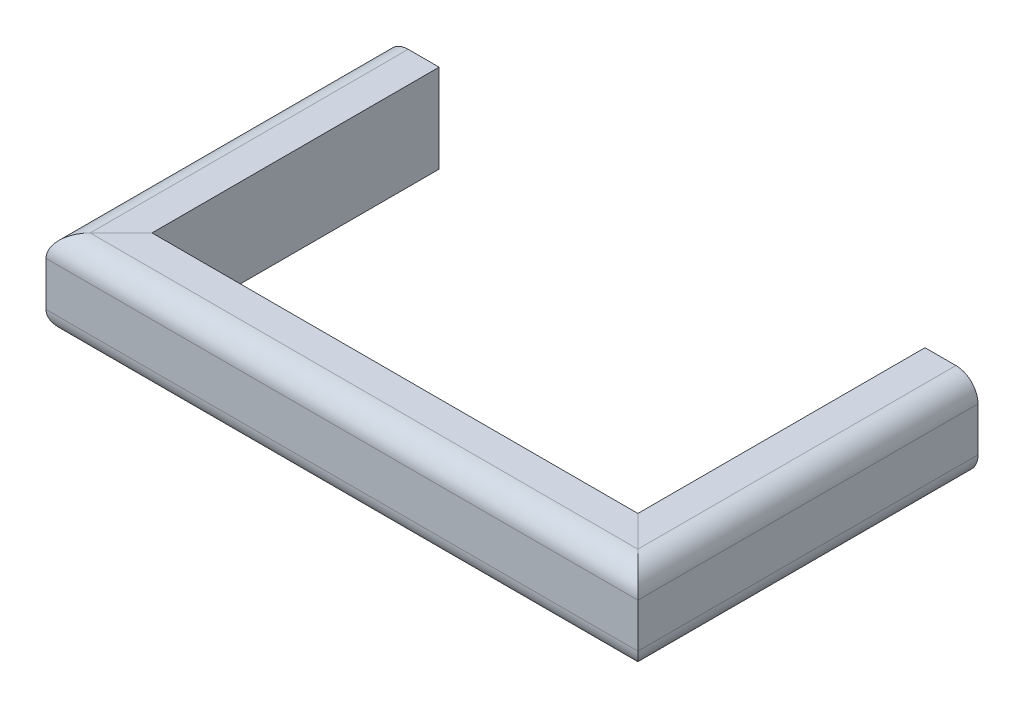
ISO-10303-21;
HEADER;
FILE_DESCRIPTION(('STEP AP214'),'2;1');
FILE_NAME('part.step','',(''),(''),'','','');
FILE_SCHEMA(('AUTOMOTIVE_DESIGN { 1 0 10303 214 1 1 1 1 }'));
ENDSEC;
DATA;
#1=APPLICATION_CONTEXT('core data for automotive mechanical design processes');
#2=APPLICATION_PROTOCOL_DEFINITION('international standard','automotive_design',2000,#1);
#3=PRODUCT_CONTEXT('',#1,'mechanical');
#4=PRODUCT('Part','Part','',(#3));
#5=PRODUCT_RELATED_PRODUCT_CATEGORY('part','',(#4));
#6=PRODUCT_DEFINITION_FORMATION('','',#4);
#7=PRODUCT_DEFINITION_CONTEXT('part definition',#1,'design');
#8=PRODUCT_DEFINITION('design','',#6,#7);
#9=PRODUCT_DEFINITION_SHAPE('','',#8);
#10=(LENGTH_UNIT() NAMED_UNIT(*) SI_UNIT(.MILLI.,.METRE.));
#11=(NAMED_UNIT(*) PLANE_ANGLE_UNIT() SI_UNIT($,.RADIAN.));
#12=(NAMED_UNIT(*) SI_UNIT($,.STERADIAN.) SOLID_ANGLE_UNIT());
#13=UNCERTAINTY_MEASURE_WITH_UNIT(LENGTH_MEASURE(1.E-05),#10,'distance_accuracy_value','');
#14=(GEOMETRIC_REPRESENTATION_CONTEXT(3) GLOBAL_UNCERTAINTY_ASSIGNED_CONTEXT((#13)) GLOBAL_UNIT_ASSIGNED_CONTEXT((#10,
#11,#12)) REPRESENTATION_CONTEXT('',''));
#15=CARTESIAN_POINT('',(0.,0.,0.));
#16=DIRECTION('',(0.,0.,1.));
#17=DIRECTION('',(1.,0.,0.));
#18=AXIS2_PLACEMENT_3D('',#15,#16,#17);
#19=CARTESIAN_POINT('',(393.7,31.7499999999999,457.2));
#20=DIRECTION('',(0.,0.,-1.));
#21=DIRECTION('',(-1.,0.,0.));
#22=AXIS2_PLACEMENT_3D('',#19,#20,#21);
#23=CYLINDRICAL_SURFACE('',#22,31.75);
#24=CARTESIAN_POINT('',(393.7,31.7499999999999,-2.22044604925031E-13));
#25=DIRECTION('',(0.,0.,-1.));
#26=DIRECTION('',(-1.,0.,0.));
#27=AXIS2_PLACEMENT_3D('',#24,#25,#26);
#28=CIRCLE('',#27,31.75);
#29=CARTESIAN_POINT('',(393.7,63.5,-2.42114021139409E-13));
#30=VERTEX_POINT('',#29);
#31=CARTESIAN_POINT('',(425.45,31.7499999999999,-2.22044604925031E-13));
#32=VERTEX_POINT('',#31);
#33=EDGE_CURVE('E55',#30,#32,#28,.T.);
#34=ORIENTED_EDGE('',*,*,#33,.F.);
#35=DIRECTION('',(0.,0.,-1.));
#36=VECTOR('',#35,1.);
#37=CARTESIAN_POINT('',(393.7,63.5,457.2));
#38=LINE('',#37,#36);
#39=CARTESIAN_POINT('',(393.7,63.5,457.2));
#40=VERTEX_POINT('',#39);
#41=EDGE_CURVE('E215',#40,#30,#38,.T.);
#42=ORIENTED_EDGE('',*,*,#41,.F.);
#43=CARTESIAN_POINT('',(393.7,31.7499999999999,457.2));
#44=DIRECTION('',(0.707106781186547,0.,-0.707106781186548));
#45=DIRECTION('',(0.707106781186548,0.,0.707106781186547));
#46=AXIS2_PLACEMENT_3D('',#43,#44,#45);
#47=ELLIPSE('',#46,44.9012806053458,31.75);
#48=CARTESIAN_POINT('',(425.45,31.7499999999999,488.95));
#49=VERTEX_POINT('',#48);
#50=EDGE_CURVE('E211',#49,#40,#47,.F.);
#51=ORIENTED_EDGE('',*,*,#50,.F.);
#52=DIRECTION('',(0.,0.,-1.));
#53=VECTOR('',#52,1.);
#54=CARTESIAN_POINT('',(425.45,31.7499999999999,488.95));
#55=LINE('',#54,#53);
#56=EDGE_CURVE('E230',#49,#32,#55,.T.);
#57=ORIENTED_EDGE('',*,*,#56,.T.);
#58=EDGE_LOOP('',(#34,#42,#51,#57));
#59=FACE_BOUND('',#58,.T.);
#60=ADVANCED_FACE('F46',(#59),#23,.T.);
#61=CARTESIAN_POINT('',(1.11022302462516E-13,63.5,63.4999999999998));
#62=DIRECTION('',(0.,-1.,0.));
#63=DIRECTION('',(0.,0.,-1.));
#64=AXIS2_PLACEMENT_3D('',#61,#62,#63);
#65=PLANE('',#64);
#66=DIRECTION('',(1.,0.,0.));
#67=VECTOR('',#66,1.);
#68=CARTESIAN_POINT('',(0.,63.5,0.));
#69=LINE('',#68,#67);
#70=CARTESIAN_POINT('',(349.25,63.5,-2.22044604925031E-13));
#71=VERTEX_POINT('',#70);
#72=EDGE_CURVE('E77',#71,#30,#69,.T.);
#73=ORIENTED_EDGE('',*,*,#72,.F.);
#74=DIRECTION('',(0.,0.,-1.));
#75=VECTOR('',#74,1.);
#76=CARTESIAN_POINT('',(349.25,63.5,412.75));
#77=LINE('',#76,#75);
#78=CARTESIAN_POINT('',(349.25,63.5,412.75));
#79=VERTEX_POINT('',#78);
#80=EDGE_CURVE('E218',#79,#71,#77,.T.);
#81=ORIENTED_EDGE('',*,*,#80,.F.);
#82=DIRECTION('',(-0.707106781186548,0.,-0.707106781186547));
#83=VECTOR('',#82,1.);
#84=CARTESIAN_POINT('',(1.11022302462516E-13,63.5,63.4999999999998));
#85=LINE('',#84,#83);
#86=EDGE_CURVE('E214',#40,#79,#85,.T.);
#87=ORIENTED_EDGE('',*,*,#86,.F.);
#88=ORIENTED_EDGE('',*,*,#41,.T.);
#89=EDGE_LOOP('',(#73,#81,#87,#88));
#90=FACE_BOUND('',#89,.T.);
#91=ADVANCED_FACE('F299',(#90),#65,.F.);
#92=CARTESIAN_POINT('',(349.25,63.5,412.75));
#93=DIRECTION('',(1.,0.,0.));
#94=DIRECTION('',(0.,0.,-1.));
#95=AXIS2_PLACEMENT_3D('',#92,#93,#94);
#96=PLANE('',#95);
#97=DIRECTION('',(0.,1.,0.));
#98=VECTOR('',#97,1.);
#99=CARTESIAN_POINT('',(349.25,63.5,-2.22044604925031E-13));
#100=LINE('',#99,#98);
#101=CARTESIAN_POINT('',(349.25,-63.5,-2.24179649203157E-13));
#102=VERTEX_POINT('',#101);
#103=EDGE_CURVE('E74',#102,#71,#100,.T.);
#104=ORIENTED_EDGE('',*,*,#103,.F.);
#105=DIRECTION('',(0.,0.,-1.));
#106=VECTOR('',#105,1.);
#107=CARTESIAN_POINT('',(349.25,-63.5,412.75));
#108=LINE('',#107,#106);
#109=CARTESIAN_POINT('',(349.25,-63.5,412.75));
#110=VERTEX_POINT('',#109);
#111=EDGE_CURVE('E222',#110,#102,#108,.T.);
#112=ORIENTED_EDGE('',*,*,#111,.F.);
#113=DIRECTION('',(0.,-1.,0.));
#114=VECTOR('',#113,1.);
#115=CARTESIAN_POINT('',(349.25,63.5,412.75));
#116=LINE('',#115,#114);
#117=EDGE_CURVE('E249',#79,#110,#116,.T.);
#118=ORIENTED_EDGE('',*,*,#117,.F.);
#119=ORIENTED_EDGE('',*,*,#80,.T.);
#120=EDGE_LOOP('',(#104,#112,#118,#119));
#121=FACE_BOUND('',#120,.T.);
#122=ADVANCED_FACE('F302',(#121),#96,.F.);
#123=CARTESIAN_POINT('',(1.11022302462516E-13,-63.5,63.4999999999998));
#124=DIRECTION('',(0.,1.,0.));
#125=DIRECTION('',(0.,0.,1.));
#126=AXIS2_PLACEMENT_3D('',#123,#124,#125);
#127=PLANE('',#126);
#128=DIRECTION('',(-1.,0.,0.));
#129=VECTOR('',#128,1.);
#130=CARTESIAN_POINT('',(0.,-63.5,0.));
#131=LINE('',#130,#129);
#132=CARTESIAN_POINT('',(393.7,-63.5,-2.22044604925031E-13));
#133=VERTEX_POINT('',#132);
#134=EDGE_CURVE('E71',#133,#102,#131,.T.);
#135=ORIENTED_EDGE('',*,*,#134,.F.);
#136=DIRECTION('',(0.,0.,-1.));
#137=VECTOR('',#136,1.);
#138=CARTESIAN_POINT('',(393.7,-63.5,457.2));
#139=LINE('',#138,#137);
#140=CARTESIAN_POINT('',(393.7,-63.5,457.2));
#141=VERTEX_POINT('',#140);
#142=EDGE_CURVE('E225',#141,#133,#139,.T.);
#143=ORIENTED_EDGE('',*,*,#142,.F.);
#144=DIRECTION('',(0.707106781186548,0.,0.707106781186547));
#145=VECTOR('',#144,1.);
#146=CARTESIAN_POINT('',(1.11022302462516E-13,-63.5,63.4999999999998));
#147=LINE('',#146,#145);
#148=EDGE_CURVE('E246',#110,#141,#147,.T.);
#149=ORIENTED_EDGE('',*,*,#148,.F.);
#150=ORIENTED_EDGE('',*,*,#111,.T.);
#151=EDGE_LOOP('',(#135,#143,#149,#150));
#152=FACE_BOUND('',#151,.T.);
#153=ADVANCED_FACE('F290',(#152),#127,.F.);
#154=CARTESIAN_POINT('',(393.7,-31.75,457.2));
#155=DIRECTION('',(0.,0.,-1.));
#156=DIRECTION('',(-1.,0.,0.));
#157=AXIS2_PLACEMENT_3D('',#154,#155,#156);
#158=CYLINDRICAL_SURFACE('',#157,31.75);
#159=CARTESIAN_POINT('',(393.7,-31.75,-2.22044604925031E-13));
#160=DIRECTION('',(0.,0.,-1.));
#161=DIRECTION('',(-1.,0.,0.));
#162=AXIS2_PLACEMENT_3D('',#159,#160,#161);
#163=CIRCLE('',#162,31.75);
#164=CARTESIAN_POINT('',(425.45,-31.75,-2.22044604925031E-13));
#165=VERTEX_POINT('',#164);
#166=EDGE_CURVE('E231',#165,#133,#163,.T.);
#167=ORIENTED_EDGE('',*,*,#166,.F.);
#168=DIRECTION('',(0.,0.,-1.));
#169=VECTOR('',#168,1.);
#170=CARTESIAN_POINT('',(425.45,-31.75,488.95));
#171=LINE('',#170,#169);
#172=CARTESIAN_POINT('',(425.45,-31.75,488.95));
#173=VERTEX_POINT('',#172);
#174=EDGE_CURVE('E228',#173,#165,#171,.T.);
#175=ORIENTED_EDGE('',*,*,#174,.F.);
#176=CARTESIAN_POINT('',(393.7,-31.75,457.2));
#177=DIRECTION('',(0.707106781186547,0.,-0.707106781186548));
#178=DIRECTION('',(0.707106781186548,0.,0.707106781186547));
#179=AXIS2_PLACEMENT_3D('',#176,#177,#178);
#180=ELLIPSE('',#179,44.9012806053458,31.75);
#181=EDGE_CURVE('E243',#141,#173,#180,.F.);
#182=ORIENTED_EDGE('',*,*,#181,.F.);
#183=ORIENTED_EDGE('',*,*,#142,.T.);
#184=EDGE_LOOP('',(#167,#175,#182,#183));
#185=FACE_BOUND('',#184,.T.);
#186=ADVANCED_FACE('F293',(#185),#158,.T.);
#187=CARTESIAN_POINT('',(425.45,31.7499999999999,488.95));
#188=DIRECTION('',(-1.,0.,0.));
#189=DIRECTION('',(0.,0.,1.));
#190=AXIS2_PLACEMENT_3D('',#187,#188,#189);
#191=PLANE('',#190);
#192=DIRECTION('',(0.,-1.,0.));
#193=VECTOR('',#192,1.);
#194=CARTESIAN_POINT('',(425.45,31.7499999999999,-2.22044604925031E-13));
#195=LINE('',#194,#193);
#196=EDGE_CURVE('E12',#32,#165,#195,.T.);
#197=ORIENTED_EDGE('',*,*,#196,.F.);
#198=ORIENTED_EDGE('',*,*,#56,.F.);
#199=DIRECTION('',(0.,1.,0.));
#200=VECTOR('',#199,1.);
#201=CARTESIAN_POINT('',(425.45,31.7499999999999,488.95));
#202=LINE('',#201,#200);
#203=EDGE_CURVE('E219',#173,#49,#202,.T.);
#204=ORIENTED_EDGE('',*,*,#203,.F.);
#205=ORIENTED_EDGE('',*,*,#174,.T.);
#206=EDGE_LOOP('',(#197,#198,#204,#205));
#207=FACE_BOUND('',#206,.T.);
#208=ADVANCED_FACE('F48',(#207),#191,.F.);
#209=CARTESIAN_POINT('',(-442.353089064535,63.5,505.853089064535));
#210=DIRECTION('',(0.,1.,0.));
#211=DIRECTION('',(0.,0.,1.));
#212=AXIS2_PLACEMENT_3D('',#209,#210,#211);
#213=PLANE('',#212);
#214=DIRECTION('',(1.,0.,0.));
#215=VECTOR('',#214,1.);
#216=CARTESIAN_POINT('',(-393.7,63.5,457.2));
#217=LINE('',#216,#215);
#218=CARTESIAN_POINT('',(-393.7,63.5,457.2));
#219=VERTEX_POINT('',#218);
#220=EDGE_CURVE('E208',#219,#40,#217,.T.);
#221=ORIENTED_EDGE('',*,*,#220,.T.);
#222=ORIENTED_EDGE('',*,*,#86,.T.);
#223=DIRECTION('',(1.,0.,0.));
#224=VECTOR('',#223,1.);
#225=CARTESIAN_POINT('',(-349.25,63.5,412.75));
#226=LINE('',#225,#224);
#227=CARTESIAN_POINT('',(-349.25,63.5,412.75));
#228=VERTEX_POINT('',#227);
#229=EDGE_CURVE('E193',#228,#79,#226,.T.);
#230=ORIENTED_EDGE('',*,*,#229,.F.);
#231=DIRECTION('',(-0.707106781186547,0.,0.707106781186548));
#232=VECTOR('',#231,1.);
#233=CARTESIAN_POINT('',(-442.353089064535,63.5,505.853089064535));
#234=LINE('',#233,#232);
#235=EDGE_CURVE('E145',#228,#219,#234,.T.);
#236=ORIENTED_EDGE('',*,*,#235,.T.);
#237=EDGE_LOOP('',(#221,#222,#230,#236));
#238=FACE_BOUND('',#237,.T.);
#239=ADVANCED_FACE('F267',(#238),#213,.T.);
#240=CARTESIAN_POINT('',(-349.25,63.5,412.75));
#241=DIRECTION('',(0.,0.,-1.));
#242=DIRECTION('',(-1.,0.,0.));
#243=AXIS2_PLACEMENT_3D('',#240,#241,#242);
#244=PLANE('',#243);
#245=CARTESIAN_POINT('',(-342.9,50.8000000000006,412.75));
#246=DIRECTION('',(0.,0.,-1.));
#247=DIRECTION('',(1.,0.,0.));
#248=AXIS2_PLACEMENT_3D('',#245,#246,#247);
#249=CIRCLE('',#248,3.17499999999996);
#250=CARTESIAN_POINT('',(-339.725,50.8000000000006,412.75));
#251=VERTEX_POINT('',#250);
#252=EDGE_CURVE('E527',#251,#251,#249,.T.);
#253=ORIENTED_EDGE('',*,*,#252,.F.);
#254=EDGE_LOOP('',(#253));
#255=FACE_BOUND('',#254,.T.);
#256=CARTESIAN_POINT('',(-330.2,50.8000000000005,412.75));
#257=DIRECTION('',(0.,0.,-1.));
#258=DIRECTION('',(1.,0.,0.));
#259=AXIS2_PLACEMENT_3D('',#256,#257,#258);
#260=CIRCLE('',#259,3.17499999999997);
#261=CARTESIAN_POINT('',(-327.025,50.8000000000005,412.75));
#262=VERTEX_POINT('',#261);
#263=EDGE_CURVE('E526',#262,#262,#260,.T.);
#264=ORIENTED_EDGE('',*,*,#263,.F.);
#265=EDGE_LOOP('',(#264));
#266=FACE_BOUND('',#265,.T.);
#267=CARTESIAN_POINT('',(330.2,50.8,412.75));
#268=DIRECTION('',(0.,0.,-1.));
#269=DIRECTION('',(-1.,0.,0.));
#270=AXIS2_PLACEMENT_3D('',#267,#268,#269);
#271=CIRCLE('',#270,3.17499999999997);
#272=CARTESIAN_POINT('',(327.025,50.8,412.75));
#273=VERTEX_POINT('',#272);
#274=EDGE_CURVE('E536',#273,#273,#271,.T.);
#275=ORIENTED_EDGE('',*,*,#274,.F.);
#276=EDGE_LOOP('',(#275));
#277=FACE_BOUND('',#276,.T.);
#278=CARTESIAN_POINT('',(342.9,50.8,412.75));
#279=DIRECTION('',(0.,0.,-1.));
#280=DIRECTION('',(-1.,0.,0.));
#281=AXIS2_PLACEMENT_3D('',#278,#279,#280);
#282=CIRCLE('',#281,3.17499999999997);
#283=CARTESIAN_POINT('',(339.725,50.8,412.75));
#284=VERTEX_POINT('',#283);
#285=EDGE_CURVE('E168',#284,#284,#282,.T.);
#286=ORIENTED_EDGE('',*,*,#285,.F.);
#287=EDGE_LOOP('',(#286));
#288=FACE_BOUND('',#287,.T.);
#289=ORIENTED_EDGE('',*,*,#229,.T.);
#290=ORIENTED_EDGE('',*,*,#117,.T.);
#291=DIRECTION('',(1.,0.,0.));
#292=VECTOR('',#291,1.);
#293=CARTESIAN_POINT('',(-349.25,-63.5,412.75));
#294=LINE('',#293,#292);
#295=CARTESIAN_POINT('',(-349.25,-63.5,412.75));
#296=VERTEX_POINT('',#295);
#297=EDGE_CURVE('E196',#296,#110,#294,.T.);
#298=ORIENTED_EDGE('',*,*,#297,.F.);
#299=DIRECTION('',(0.,1.,0.));
#300=VECTOR('',#299,1.);
#301=CARTESIAN_POINT('',(-349.25,63.5,412.75));
#302=LINE('',#301,#300);
#303=EDGE_CURVE('E190',#296,#228,#302,.T.);
#304=ORIENTED_EDGE('',*,*,#303,.T.);
#305=EDGE_LOOP('',(#289,#290,#298,#304));
#306=FACE_BOUND('',#305,.T.);
#307=ADVANCED_FACE('F304',(#255,#266,#277,#288,#306),#244,.T.);
#308=CARTESIAN_POINT('',(-442.353089064535,-63.5,505.853089064535));
#309=DIRECTION('',(0.,-1.,0.));
#310=DIRECTION('',(0.,0.,-1.));
#311=AXIS2_PLACEMENT_3D('',#308,#309,#310);
#312=PLANE('',#311);
#313=ORIENTED_EDGE('',*,*,#297,.T.);
#314=ORIENTED_EDGE('',*,*,#148,.T.);
#315=DIRECTION('',(1.,0.,0.));
#316=VECTOR('',#315,1.);
#317=CARTESIAN_POINT('',(-393.7,-63.5,457.2));
#318=LINE('',#317,#316);
#319=CARTESIAN_POINT('',(-393.7,-63.5,457.2));
#320=VERTEX_POINT('',#319);
#321=EDGE_CURVE('E199',#320,#141,#318,.T.);
#322=ORIENTED_EDGE('',*,*,#321,.F.);
#323=DIRECTION('',(0.707106781186547,0.,-0.707106781186548));
#324=VECTOR('',#323,1.);
#325=CARTESIAN_POINT('',(-442.353089064535,-63.5,505.853089064535));
#326=LINE('',#325,#324);
#327=EDGE_CURVE('E149',#320,#296,#326,.T.);
#328=ORIENTED_EDGE('',*,*,#327,.T.);
#329=EDGE_LOOP('',(#313,#314,#322,#328));
#330=FACE_BOUND('',#329,.T.);
#331=ADVANCED_FACE('F287',(#330),#312,.T.);
#332=CARTESIAN_POINT('',(-393.7,-31.75,457.2));
#333=DIRECTION('',(1.,0.,0.));
#334=DIRECTION('',(0.,0.,-1.));
#335=AXIS2_PLACEMENT_3D('',#332,#333,#334);
#336=CYLINDRICAL_SURFACE('',#335,31.75);
#337=ORIENTED_EDGE('',*,*,#321,.T.);
#338=ORIENTED_EDGE('',*,*,#181,.T.);
#339=DIRECTION('',(1.,0.,0.));
#340=VECTOR('',#339,1.);
#341=CARTESIAN_POINT('',(-425.45,-31.75,488.95));
#342=LINE('',#341,#340);
#343=CARTESIAN_POINT('',(-425.45,-31.75,488.95));
#344=VERTEX_POINT('',#343);
#345=EDGE_CURVE('E202',#344,#173,#342,.T.);
#346=ORIENTED_EDGE('',*,*,#345,.F.);
#347=CARTESIAN_POINT('',(-393.7,-31.75,457.2));
#348=DIRECTION('',(0.707106781186548,0.,0.707106781186547));
#349=DIRECTION('',(0.707106781186547,0.,-0.707106781186548));
#350=AXIS2_PLACEMENT_3D('',#347,#348,#349);
#351=ELLIPSE('',#350,44.9012806053458,31.75);
#352=EDGE_CURVE('E256',#344,#320,#351,.T.);
#353=ORIENTED_EDGE('',*,*,#352,.T.);
#354=EDGE_LOOP('',(#337,#338,#346,#353));
#355=FACE_BOUND('',#354,.T.);
#356=ADVANCED_FACE('F283',(#355),#336,.T.);
#357=CARTESIAN_POINT('',(-425.45,31.7499999999999,488.95));
#358=DIRECTION('',(0.,0.,1.));
#359=DIRECTION('',(1.,0.,0.));
#360=AXIS2_PLACEMENT_3D('',#357,#358,#359);
#361=PLANE('',#360);
#362=ORIENTED_EDGE('',*,*,#345,.T.);
#363=ORIENTED_EDGE('',*,*,#203,.T.);
#364=DIRECTION('',(1.,0.,0.));
#365=VECTOR('',#364,1.);
#366=CARTESIAN_POINT('',(-425.45,31.7499999999999,488.95));
#367=LINE('',#366,#365);
#368=CARTESIAN_POINT('',(-425.45,31.7499999999999,488.95));
#369=VERTEX_POINT('',#368);
#370=EDGE_CURVE('E205',#369,#49,#367,.T.);
#371=ORIENTED_EDGE('',*,*,#370,.F.);
#372=DIRECTION('',(0.,-1.,0.));
#373=VECTOR('',#372,1.);
#374=CARTESIAN_POINT('',(-425.45,31.7499999999999,488.95));
#375=LINE('',#374,#373);
#376=EDGE_CURVE('E259',#369,#344,#375,.T.);
#377=ORIENTED_EDGE('',*,*,#376,.T.);
#378=EDGE_LOOP('',(#362,#363,#371,#377));
#379=FACE_BOUND('',#378,.T.);
#380=ADVANCED_FACE('F277',(#379),#361,.T.);
#381=CARTESIAN_POINT('',(-393.7,31.7499999999999,457.2));
#382=DIRECTION('',(1.,0.,0.));
#383=DIRECTION('',(0.,0.,-1.));
#384=AXIS2_PLACEMENT_3D('',#381,#382,#383);
#385=CYLINDRICAL_SURFACE('',#384,31.75);
#386=ORIENTED_EDGE('',*,*,#370,.T.);
#387=ORIENTED_EDGE('',*,*,#50,.T.);
#388=ORIENTED_EDGE('',*,*,#220,.F.);
#389=CARTESIAN_POINT('',(-393.7,31.7499999999999,457.2));
#390=DIRECTION('',(0.707106781186548,0.,0.707106781186547));
#391=DIRECTION('',(0.707106781186547,0.,-0.707106781186548));
#392=AXIS2_PLACEMENT_3D('',#389,#390,#391);
#393=ELLIPSE('',#392,44.9012806053458,31.75);
#394=EDGE_CURVE('E261',#219,#369,#393,.T.);
#395=ORIENTED_EDGE('',*,*,#394,.T.);
#396=EDGE_LOOP('',(#386,#387,#388,#395));
#397=FACE_BOUND('',#396,.T.);
#398=ADVANCED_FACE('F296',(#397),#385,.T.);
#399=CARTESIAN_POINT('',(-349.25,63.5,598.956178129071));
#400=DIRECTION('',(0.,-1.,0.));
#401=DIRECTION('',(0.,0.,-1.));
#402=AXIS2_PLACEMENT_3D('',#399,#400,#401);
#403=PLANE('',#402);
#404=ORIENTED_EDGE('',*,*,#235,.F.);
#405=DIRECTION('',(0.,0.,-1.));
#406=VECTOR('',#405,1.);
#407=CARTESIAN_POINT('',(-349.25,63.5,598.956178129071));
#408=LINE('',#407,#406);
#409=CARTESIAN_POINT('',(-349.25,63.5,0.));
#410=VERTEX_POINT('',#409);
#411=EDGE_CURVE('E138',#228,#410,#408,.T.);
#412=ORIENTED_EDGE('',*,*,#411,.T.);
#413=DIRECTION('',(-1.,0.,0.));
#414=VECTOR('',#413,1.);
#415=CARTESIAN_POINT('',(-349.25,63.5,0.));
#416=LINE('',#415,#414);
#417=CARTESIAN_POINT('',(-393.7,63.5,0.));
#418=VERTEX_POINT('',#417);
#419=EDGE_CURVE('E142',#410,#418,#416,.T.);
#420=ORIENTED_EDGE('',*,*,#419,.T.);
#421=DIRECTION('',(0.,0.,-1.));
#422=VECTOR('',#421,1.);
#423=CARTESIAN_POINT('',(-393.7,63.5,598.956178129071));
#424=LINE('',#423,#422);
#425=EDGE_CURVE('E150',#219,#418,#424,.T.);
#426=ORIENTED_EDGE('',*,*,#425,.F.);
#427=EDGE_LOOP('',(#404,#412,#420,#426));
#428=FACE_BOUND('',#427,.T.);
#429=ADVANCED_FACE('F140',(#428),#403,.F.);
#430=CARTESIAN_POINT('',(-393.7,31.7499999999999,598.956178129071));
#431=DIRECTION('',(0.,0.,-1.));
#432=DIRECTION('',(-1.,0.,0.));
#433=AXIS2_PLACEMENT_3D('',#430,#431,#432);
#434=CYLINDRICAL_SURFACE('',#433,31.75);
#435=ORIENTED_EDGE('',*,*,#394,.F.);
#436=ORIENTED_EDGE('',*,*,#425,.T.);
#437=CARTESIAN_POINT('',(-393.7,31.7499999999999,0.));
#438=DIRECTION('',(0.,0.,1.));
#439=DIRECTION('',(-1.,0.,0.));
#440=AXIS2_PLACEMENT_3D('',#437,#438,#439);
#441=CIRCLE('',#440,31.75);
#442=CARTESIAN_POINT('',(-425.45,31.7499999999999,0.));
#443=VERTEX_POINT('',#442);
#444=EDGE_CURVE('E159',#418,#443,#441,.T.);
#445=ORIENTED_EDGE('',*,*,#444,.T.);
#446=DIRECTION('',(0.,0.,-1.));
#447=VECTOR('',#446,1.);
#448=CARTESIAN_POINT('',(-425.45,31.7499999999999,598.956178129071));
#449=LINE('',#448,#447);
#450=EDGE_CURVE('E187',#369,#443,#449,.T.);
#451=ORIENTED_EDGE('',*,*,#450,.F.);
#452=EDGE_LOOP('',(#435,#436,#445,#451));
#453=FACE_BOUND('',#452,.T.);
#454=ADVANCED_FACE('F270',(#453),#434,.T.);
#455=CARTESIAN_POINT('',(-425.45,31.7499999999999,598.956178129071));
#456=DIRECTION('',(1.,0.,0.));
#457=DIRECTION('',(0.,0.,-1.));
#458=AXIS2_PLACEMENT_3D('',#455,#456,#457);
#459=PLANE('',#458);
#460=ORIENTED_EDGE('',*,*,#376,.F.);
#461=ORIENTED_EDGE('',*,*,#450,.T.);
#462=DIRECTION('',(0.,-1.,0.));
#463=VECTOR('',#462,1.);
#464=CARTESIAN_POINT('',(-425.45,31.7499999999999,0.));
#465=LINE('',#464,#463);
#466=CARTESIAN_POINT('',(-425.45,-31.75,0.));
#467=VERTEX_POINT('',#466);
#468=EDGE_CURVE('E174',#443,#467,#465,.T.);
#469=ORIENTED_EDGE('',*,*,#468,.T.);
#470=DIRECTION('',(0.,0.,-1.));
#471=VECTOR('',#470,1.);
#472=CARTESIAN_POINT('',(-425.45,-31.75,598.956178129071));
#473=LINE('',#472,#471);
#474=EDGE_CURVE('E185',#344,#467,#473,.T.);
#475=ORIENTED_EDGE('',*,*,#474,.F.);
#476=EDGE_LOOP('',(#460,#461,#469,#475));
#477=FACE_BOUND('',#476,.T.);
#478=ADVANCED_FACE('F272',(#477),#459,.F.);
#479=CARTESIAN_POINT('',(-393.7,-31.75,598.956178129071));
#480=DIRECTION('',(0.,0.,-1.));
#481=DIRECTION('',(-1.,0.,0.));
#482=AXIS2_PLACEMENT_3D('',#479,#480,#481);
#483=CYLINDRICAL_SURFACE('',#482,31.75);
#484=ORIENTED_EDGE('',*,*,#352,.F.);
#485=ORIENTED_EDGE('',*,*,#474,.T.);
#486=CARTESIAN_POINT('',(-393.7,-31.75,0.));
#487=DIRECTION('',(0.,0.,1.));
#488=DIRECTION('',(-1.,0.,0.));
#489=AXIS2_PLACEMENT_3D('',#486,#487,#488);
#490=CIRCLE('',#489,31.75);
#491=CARTESIAN_POINT('',(-393.7,-63.5,0.));
#492=VERTEX_POINT('',#491);
#493=EDGE_CURVE('E177',#467,#492,#490,.T.);
#494=ORIENTED_EDGE('',*,*,#493,.T.);
#495=DIRECTION('',(0.,0.,-1.));
#496=VECTOR('',#495,1.);
#497=CARTESIAN_POINT('',(-393.7,-63.5,598.956178129071));
#498=LINE('',#497,#496);
#499=EDGE_CURVE('E183',#320,#492,#498,.T.);
#500=ORIENTED_EDGE('',*,*,#499,.F.);
#501=EDGE_LOOP('',(#484,#485,#494,#500));
#502=FACE_BOUND('',#501,.T.);
#503=ADVANCED_FACE('F280',(#502),#483,.T.);
#504=CARTESIAN_POINT('',(-349.25,-63.5,598.956178129071));
#505=DIRECTION('',(0.,1.,0.));
#506=DIRECTION('',(0.,0.,1.));
#507=AXIS2_PLACEMENT_3D('',#504,#505,#506);
#508=PLANE('',#507);
#509=ORIENTED_EDGE('',*,*,#327,.F.);
#510=ORIENTED_EDGE('',*,*,#499,.T.);
#511=DIRECTION('',(1.,0.,0.));
#512=VECTOR('',#511,1.);
#513=CARTESIAN_POINT('',(-349.25,-63.5,0.));
#514=LINE('',#513,#512);
#515=CARTESIAN_POINT('',(-349.25,-63.5,0.));
#516=VERTEX_POINT('',#515);
#517=EDGE_CURVE('E180',#492,#516,#514,.T.);
#518=ORIENTED_EDGE('',*,*,#517,.T.);
#519=DIRECTION('',(0.,0.,-1.));
#520=VECTOR('',#519,1.);
#521=CARTESIAN_POINT('',(-349.25,-63.5,598.956178129071));
#522=LINE('',#521,#520);
#523=EDGE_CURVE('E163',#296,#516,#522,.T.);
#524=ORIENTED_EDGE('',*,*,#523,.F.);
#525=EDGE_LOOP('',(#509,#510,#518,#524));
#526=FACE_BOUND('',#525,.T.);
#527=ADVANCED_FACE('F285',(#526),#508,.F.);
#528=CARTESIAN_POINT('',(-349.25,63.5,598.956178129071));
#529=DIRECTION('',(-1.,0.,0.));
#530=DIRECTION('',(0.,0.,1.));
#531=AXIS2_PLACEMENT_3D('',#528,#529,#530);
#532=PLANE('',#531);
#533=ORIENTED_EDGE('',*,*,#303,.F.);
#534=ORIENTED_EDGE('',*,*,#523,.T.);
#535=DIRECTION('',(0.,1.,0.));
#536=VECTOR('',#535,1.);
#537=CARTESIAN_POINT('',(-349.25,63.5,0.));
#538=LINE('',#537,#536);
#539=EDGE_CURVE('E156',#516,#410,#538,.T.);
#540=ORIENTED_EDGE('',*,*,#539,.T.);
#541=ORIENTED_EDGE('',*,*,#411,.F.);
#542=EDGE_LOOP('',(#533,#534,#540,#541));
#543=FACE_BOUND('',#542,.T.);
#544=ADVANCED_FACE('F161',(#543),#532,.F.);
#545=CARTESIAN_POINT('',(-393.7,-31.75,0.));
#546=DIRECTION('',(0.,0.,-1.));
#547=DIRECTION('',(-1.,0.,0.));
#548=AXIS2_PLACEMENT_3D('',#545,#546,#547);
#549=PLANE('',#548);
#550=ORIENTED_EDGE('',*,*,#539,.F.);
#551=ORIENTED_EDGE('',*,*,#517,.F.);
#552=ORIENTED_EDGE('',*,*,#493,.F.);
#553=ORIENTED_EDGE('',*,*,#468,.F.);
#554=ORIENTED_EDGE('',*,*,#444,.F.);
#555=ORIENTED_EDGE('',*,*,#419,.F.);
#556=EDGE_LOOP('',(#550,#551,#552,#553,#554,#555));
#557=FACE_BOUND('',#556,.T.);
#558=ADVANCED_FACE('F154',(#557),#549,.T.);
#559=CARTESIAN_POINT('',(387.35,0.,-2.35922392732846E-13));
#560=DIRECTION('',(0.,0.,-1.));
#561=DIRECTION('',(-1.,0.,0.));
#562=AXIS2_PLACEMENT_3D('',#559,#560,#561);
#563=PLANE('',#562);
#564=ORIENTED_EDGE('',*,*,#33,.T.);
#565=ORIENTED_EDGE('',*,*,#196,.T.);
#566=ORIENTED_EDGE('',*,*,#166,.T.);
#567=ORIENTED_EDGE('',*,*,#134,.T.);
#568=ORIENTED_EDGE('',*,*,#103,.T.);
#569=ORIENTED_EDGE('',*,*,#72,.T.);
#570=EDGE_LOOP('',(#564,#565,#566,#567,#568,#569));
#571=FACE_BOUND('',#570,.T.);
#572=ADVANCED_FACE('F426',(#571),#563,.T.);
#573=CARTESIAN_POINT('',(342.9,50.8,425.45));
#574=DIRECTION('',(0.,0.,-1.));
#575=DIRECTION('',(-1.,0.,0.));
#576=AXIS2_PLACEMENT_3D('',#573,#574,#575);
#577=CYLINDRICAL_SURFACE('',#576,3.17499999999997);
#578=CARTESIAN_POINT('',(342.9,50.8,425.45));
#579=DIRECTION('',(0.,0.,-1.));
#580=DIRECTION('',(-1.,0.,0.));
#581=AXIS2_PLACEMENT_3D('',#578,#579,#580);
#582=CIRCLE('',#581,3.17499999999997);
#583=CARTESIAN_POINT('',(339.725,50.8,425.45));
#584=VERTEX_POINT('',#583);
#585=EDGE_CURVE('E165',#584,#584,#582,.T.);
#586=ORIENTED_EDGE('',*,*,#585,.F.);
#587=EDGE_LOOP('',(#586));
#588=FACE_BOUND('',#587,.T.);
#589=ORIENTED_EDGE('',*,*,#285,.T.);
#590=EDGE_LOOP('',(#589));
#591=FACE_BOUND('',#590,.T.);
#592=ADVANCED_FACE('F435',(#588,#591),#577,.F.);
#593=CARTESIAN_POINT('',(342.9,50.8,425.45));
#594=DIRECTION('',(0.,0.,-1.));
#595=DIRECTION('',(-1.,0.,0.));
#596=AXIS2_PLACEMENT_3D('',#593,#594,#595);
#597=PLANE('',#596);
#598=ORIENTED_EDGE('',*,*,#585,.T.);
#599=EDGE_LOOP('',(#598));
#600=FACE_BOUND('',#599,.T.);
#601=ADVANCED_FACE('F449',(#600),#597,.T.);
#602=CARTESIAN_POINT('',(330.2,50.8,425.45));
#603=DIRECTION('',(0.,0.,-1.));
#604=DIRECTION('',(-1.,0.,0.));
#605=AXIS2_PLACEMENT_3D('',#602,#603,#604);
#606=CYLINDRICAL_SURFACE('',#605,3.17499999999997);
#607=CARTESIAN_POINT('',(330.2,50.8,425.45));
#608=DIRECTION('',(0.,0.,-1.));
#609=DIRECTION('',(-1.,0.,0.));
#610=AXIS2_PLACEMENT_3D('',#607,#608,#609);
#611=CIRCLE('',#610,3.17499999999997);
#612=CARTESIAN_POINT('',(327.025,50.8,425.45));
#613=VERTEX_POINT('',#612);
#614=EDGE_CURVE('E538',#613,#613,#611,.T.);
#615=ORIENTED_EDGE('',*,*,#614,.F.);
#616=EDGE_LOOP('',(#615));
#617=FACE_BOUND('',#616,.T.);
#618=ORIENTED_EDGE('',*,*,#274,.T.);
#619=EDGE_LOOP('',(#618));
#620=FACE_BOUND('',#619,.T.);
#621=ADVANCED_FACE('F459',(#617,#620),#606,.F.);
#622=CARTESIAN_POINT('',(330.2,50.8,425.45));
#623=DIRECTION('',(0.,0.,-1.));
#624=DIRECTION('',(-1.,0.,0.));
#625=AXIS2_PLACEMENT_3D('',#622,#623,#624);
#626=PLANE('',#625);
#627=ORIENTED_EDGE('',*,*,#614,.T.);
#628=EDGE_LOOP('',(#627));
#629=FACE_BOUND('',#628,.T.);
#630=ADVANCED_FACE('F469',(#629),#626,.T.);
#631=CARTESIAN_POINT('',(-330.2,50.8000000000005,425.45));
#632=DIRECTION('',(0.,0.,-1.));
#633=DIRECTION('',(-1.,0.,0.));
#634=AXIS2_PLACEMENT_3D('',#631,#632,#633);
#635=CYLINDRICAL_SURFACE('',#634,3.17499999999997);
#636=CARTESIAN_POINT('',(-330.2,50.8000000000005,425.45));
#637=DIRECTION('',(0.,0.,-1.));
#638=DIRECTION('',(1.,0.,0.));
#639=AXIS2_PLACEMENT_3D('',#636,#637,#638);
#640=CIRCLE('',#639,3.17499999999997);
#641=CARTESIAN_POINT('',(-327.025,50.8000000000005,425.45));
#642=VERTEX_POINT('',#641);
#643=EDGE_CURVE('E530',#642,#642,#640,.T.);
#644=ORIENTED_EDGE('',*,*,#643,.F.);
#645=EDGE_LOOP('',(#644));
#646=FACE_BOUND('',#645,.T.);
#647=ORIENTED_EDGE('',*,*,#263,.T.);
#648=EDGE_LOOP('',(#647));
#649=FACE_BOUND('',#648,.T.);
#650=ADVANCED_FACE('F479',(#646,#649),#635,.F.);
#651=CARTESIAN_POINT('',(-330.2,50.8000000000005,425.45));
#652=DIRECTION('',(0.,0.,1.));
#653=DIRECTION('',(1.,0.,0.));
#654=AXIS2_PLACEMENT_3D('',#651,#652,#653);
#655=PLANE('',#654);
#656=ORIENTED_EDGE('',*,*,#643,.T.);
#657=EDGE_LOOP('',(#656));
#658=FACE_BOUND('',#657,.T.);
#659=ADVANCED_FACE('F489',(#658),#655,.F.);
#660=CARTESIAN_POINT('',(-342.9,50.8000000000006,425.45));
#661=DIRECTION('',(0.,0.,-1.));
#662=DIRECTION('',(-1.,0.,0.));
#663=AXIS2_PLACEMENT_3D('',#660,#661,#662);
#664=CYLINDRICAL_SURFACE('',#663,3.17499999999996);
#665=CARTESIAN_POINT('',(-342.9,50.8000000000006,425.45));
#666=DIRECTION('',(0.,0.,-1.));
#667=DIRECTION('',(1.,0.,0.));
#668=AXIS2_PLACEMENT_3D('',#665,#666,#667);
#669=CIRCLE('',#668,3.17499999999996);
#670=CARTESIAN_POINT('',(-339.725,50.8000000000006,425.45));
#671=VERTEX_POINT('',#670);
#672=EDGE_CURVE('E525',#671,#671,#669,.T.);
#673=ORIENTED_EDGE('',*,*,#672,.F.);
#674=EDGE_LOOP('',(#673));
#675=FACE_BOUND('',#674,.T.);
#676=ORIENTED_EDGE('',*,*,#252,.T.);
#677=EDGE_LOOP('',(#676));
#678=FACE_BOUND('',#677,.T.);
#679=ADVANCED_FACE('F499',(#675,#678),#664,.F.);
#680=CARTESIAN_POINT('',(-342.9,50.8000000000006,425.45));
#681=DIRECTION('',(0.,0.,1.));
#682=DIRECTION('',(1.,0.,0.));
#683=AXIS2_PLACEMENT_3D('',#680,#681,#682);
#684=PLANE('',#683);
#685=ORIENTED_EDGE('',*,*,#672,.T.);
#686=EDGE_LOOP('',(#685));
#687=FACE_BOUND('',#686,.T.);
#688=ADVANCED_FACE('F509',(#687),#684,.F.);
#689=CLOSED_SHELL('',(#60,#91,#122,#153,#186,#208,#239,#307,#331,#356,#380,#398,#429,#454,#478,
#503,#527,#544,#558,#572,#592,#601,#621,#630,#650,#659,#679,#688));
#690=MANIFOLD_SOLID_BREP('B2',#689);
#691=ADVANCED_BREP_SHAPE_REPRESENTATION('',(#18,#690),#14);
#692=SHAPE_DEFINITION_REPRESENTATION(#9,#691);
ENDSEC;
END-ISO-10303-21;
